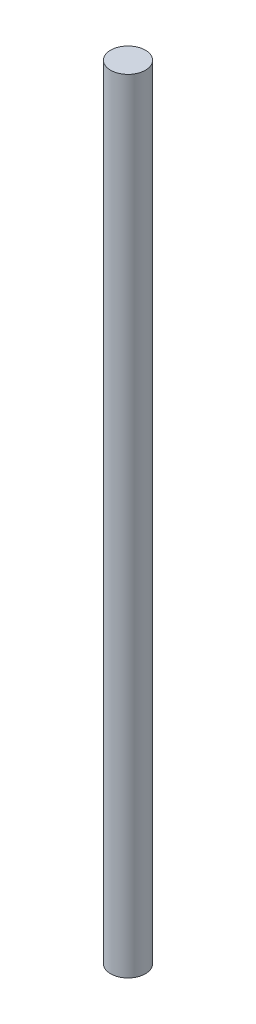
ISO-10303-21;
HEADER;
FILE_DESCRIPTION(('STEP AP214'),'2;1');
FILE_NAME('part.step','',(''),(''),'','','');
FILE_SCHEMA(('AUTOMOTIVE_DESIGN { 1 0 10303 214 1 1 1 1 }'));
ENDSEC;
DATA;
#1=APPLICATION_CONTEXT('core data for automotive mechanical design processes');
#2=APPLICATION_PROTOCOL_DEFINITION('international standard','automotive_design',2000,#1);
#3=PRODUCT_CONTEXT('',#1,'mechanical');
#4=PRODUCT('Part','Part','',(#3));
#5=PRODUCT_RELATED_PRODUCT_CATEGORY('part','',(#4));
#6=PRODUCT_DEFINITION_FORMATION('','',#4);
#7=PRODUCT_DEFINITION_CONTEXT('part definition',#1,'design');
#8=PRODUCT_DEFINITION('design','',#6,#7);
#9=PRODUCT_DEFINITION_SHAPE('','',#8);
#10=(LENGTH_UNIT() NAMED_UNIT(*) SI_UNIT(.MILLI.,.METRE.));
#11=(NAMED_UNIT(*) PLANE_ANGLE_UNIT() SI_UNIT($,.RADIAN.));
#12=(NAMED_UNIT(*) SI_UNIT($,.STERADIAN.) SOLID_ANGLE_UNIT());
#13=UNCERTAINTY_MEASURE_WITH_UNIT(LENGTH_MEASURE(1.E-05),#10,'distance_accuracy_value','');
#14=(GEOMETRIC_REPRESENTATION_CONTEXT(3) GLOBAL_UNCERTAINTY_ASSIGNED_CONTEXT((#13)) GLOBAL_UNIT_ASSIGNED_CONTEXT((#10,
#11,#12)) REPRESENTATION_CONTEXT('',''));
#15=CARTESIAN_POINT('',(0.,0.,0.));
#16=DIRECTION('',(0.,0.,1.));
#17=DIRECTION('',(1.,0.,0.));
#18=AXIS2_PLACEMENT_3D('',#15,#16,#17);
#19=CARTESIAN_POINT('',(0.,45.,0.));
#20=DIRECTION('',(0.,-1.,0.));
#21=DIRECTION('',(0.,0.,-1.));
#22=AXIS2_PLACEMENT_3D('',#19,#20,#21);
#23=CYLINDRICAL_SURFACE('',#22,1.);
#24=CARTESIAN_POINT('',(0.,45.,0.));
#25=DIRECTION('',(0.,1.,0.));
#26=DIRECTION('',(0.,0.,1.));
#27=AXIS2_PLACEMENT_3D('',#24,#25,#26);
#28=CIRCLE('',#27,1.);
#29=CARTESIAN_POINT('',(0.,45.,-1.));
#30=VERTEX_POINT('',#29);
#31=EDGE_CURVE('E10',#30,#30,#28,.T.);
#32=CARTESIAN_POINT('',(0.,0.,0.));
#33=DIRECTION('',(0.,1.,0.));
#34=DIRECTION('',(0.,0.,1.));
#35=AXIS2_PLACEMENT_3D('',#32,#33,#34);
#36=CIRCLE('',#35,1.);
#37=CARTESIAN_POINT('',(0.,0.,-1.));
#38=VERTEX_POINT('',#37);
#39=EDGE_CURVE('E38',#38,#38,#36,.T.);
#40=CARTESIAN_POINT('',(0.,45.,-1.));
#41=CARTESIAN_POINT('',(0.,44.53125,-1.));
#42=CARTESIAN_POINT('',(0.,44.0625,-1.));
#43=CARTESIAN_POINT('',(0.,43.125,-1.));
#44=CARTESIAN_POINT('',(0.,42.65625,-1.));
#45=CARTESIAN_POINT('',(0.,41.71875,-1.));
#46=CARTESIAN_POINT('',(0.,41.25,-1.));
#47=CARTESIAN_POINT('',(0.,40.3125,-1.));
#48=CARTESIAN_POINT('',(0.,39.84375,-1.));
#49=CARTESIAN_POINT('',(0.,38.90625,-1.));
#50=CARTESIAN_POINT('',(0.,38.4375,-1.));
#51=CARTESIAN_POINT('',(0.,37.5,-1.));
#52=CARTESIAN_POINT('',(0.,37.03125,-1.));
#53=CARTESIAN_POINT('',(0.,36.09375,-1.));
#54=CARTESIAN_POINT('',(0.,35.625,-1.));
#55=CARTESIAN_POINT('',(0.,34.6875,-1.));
#56=CARTESIAN_POINT('',(0.,34.21875,-1.));
#57=CARTESIAN_POINT('',(0.,33.28125,-1.));
#58=CARTESIAN_POINT('',(0.,32.8125,-1.));
#59=CARTESIAN_POINT('',(0.,31.875,-1.));
#60=CARTESIAN_POINT('',(0.,31.40625,-1.));
#61=CARTESIAN_POINT('',(0.,30.46875,-1.));
#62=CARTESIAN_POINT('',(0.,30.,-1.));
#63=CARTESIAN_POINT('',(0.,29.0625,-1.));
#64=CARTESIAN_POINT('',(0.,28.59375,-1.));
#65=CARTESIAN_POINT('',(0.,27.65625,-1.));
#66=CARTESIAN_POINT('',(0.,27.1875,-1.));
#67=CARTESIAN_POINT('',(0.,26.25,-1.));
#68=CARTESIAN_POINT('',(0.,25.78125,-1.));
#69=CARTESIAN_POINT('',(0.,24.84375,-1.));
#70=CARTESIAN_POINT('',(0.,24.375,-1.));
#71=CARTESIAN_POINT('',(0.,23.4375,-1.));
#72=CARTESIAN_POINT('',(0.,22.96875,-1.));
#73=CARTESIAN_POINT('',(0.,22.03125,-1.));
#74=CARTESIAN_POINT('',(0.,21.5625,-1.));
#75=CARTESIAN_POINT('',(0.,20.625,-1.));
#76=CARTESIAN_POINT('',(0.,20.15625,-1.));
#77=CARTESIAN_POINT('',(0.,19.21875,-1.));
#78=CARTESIAN_POINT('',(0.,18.75,-1.));
#79=CARTESIAN_POINT('',(0.,17.8125,-1.));
#80=CARTESIAN_POINT('',(0.,17.34375,-1.));
#81=CARTESIAN_POINT('',(0.,16.40625,-1.));
#82=CARTESIAN_POINT('',(0.,15.9375,-1.));
#83=CARTESIAN_POINT('',(0.,15.,-1.));
#84=CARTESIAN_POINT('',(0.,14.53125,-1.));
#85=CARTESIAN_POINT('',(0.,13.59375,-1.));
#86=CARTESIAN_POINT('',(0.,13.125,-1.));
#87=CARTESIAN_POINT('',(0.,12.1875,-1.));
#88=CARTESIAN_POINT('',(0.,11.71875,-1.));
#89=CARTESIAN_POINT('',(0.,10.78125,-1.));
#90=CARTESIAN_POINT('',(0.,10.3125,-1.));
#91=CARTESIAN_POINT('',(0.,9.37499999999999,-1.));
#92=CARTESIAN_POINT('',(0.,8.90624999999999,-1.));
#93=CARTESIAN_POINT('',(0.,7.96874999999999,-1.));
#94=CARTESIAN_POINT('',(0.,7.5,-1.));
#95=CARTESIAN_POINT('',(0.,6.56249999999999,-1.));
#96=CARTESIAN_POINT('',(0.,6.09374999999999,-1.));
#97=CARTESIAN_POINT('',(0.,5.15624999999999,-1.));
#98=CARTESIAN_POINT('',(0.,4.68749999999999,-1.));
#99=CARTESIAN_POINT('',(0.,3.74999999999999,-1.));
#100=CARTESIAN_POINT('',(0.,3.28124999999999,-1.));
#101=CARTESIAN_POINT('',(0.,2.34374999999999,-1.));
#102=CARTESIAN_POINT('',(0.,1.87499999999999,-1.));
#103=CARTESIAN_POINT('',(0.,0.937499999999992,-1.));
#104=CARTESIAN_POINT('',(0.,0.468749999999993,-1.));
#105=CARTESIAN_POINT('',(0.,0.,-1.));
#106=B_SPLINE_CURVE_WITH_KNOTS('',3,(#40,#41,#42,#43,#44,#45,#46,#47,#48,#49,#50,#51,#52,#53,
#54,#55,#56,#57,#58,#59,#60,#61,#62,#63,#64,#65,#66,#67,#68,#69,#70,#71,#72,#73,#74,#75,#76,#77,
#78,#79,#80,#81,#82,#83,#84,#85,#86,#87,#88,#89,#90,#91,#92,#93,#94,#95,#96,#97,#98,#99,#100,
#101,#102,#103,#104,#105),.UNSPECIFIED.,.F.,.F.,(4,2,2,2,2,2,2,2,2,2,2,2,2,2,2,2,2,2,2,2,2,2,2,
2,2,2,2,2,2,2,2,2,4),(0.,1.40625,2.8125,4.21874999999999,5.625,7.03125,8.43749999999999,9.84375,
11.25,12.65625,14.0625,15.46875,16.875,18.28125,19.6875,21.09375,22.5,23.90625,25.3125,26.71875,
28.125,29.53125,30.9375,32.34375,33.75,35.15625,36.5625,37.96875,39.375,40.78125,42.1875,
43.59375,45.),.UNSPECIFIED.);
#107=EDGE_CURVE('BSEAM35',#30,#38,#106,.T.);
#108=ORIENTED_EDGE('',*,*,#31,.F.);
#109=ORIENTED_EDGE('',*,*,#39,.T.);
#110=ORIENTED_EDGE('',*,*,#107,.T.);
#111=ORIENTED_EDGE('',*,*,#107,.F.);
#112=EDGE_LOOP('',(#108,#110,#109,#111));
#113=FACE_BOUND('',#112,.T.);
#114=ADVANCED_FACE('F35',(#113),#23,.T.);
#115=CARTESIAN_POINT('',(0.,45.,0.));
#116=DIRECTION('',(0.,1.,0.));
#117=DIRECTION('',(0.,0.,1.));
#118=AXIS2_PLACEMENT_3D('',#115,#116,#117);
#119=PLANE('',#118);
#120=ORIENTED_EDGE('',*,*,#31,.T.);
#121=EDGE_LOOP('',(#120));
#122=FACE_BOUND('',#121,.T.);
#123=ADVANCED_FACE('F50',(#122),#119,.T.);
#124=CARTESIAN_POINT('',(0.,0.,0.));
#125=DIRECTION('',(0.,1.,0.));
#126=DIRECTION('',(0.,0.,1.));
#127=AXIS2_PLACEMENT_3D('',#124,#125,#126);
#128=PLANE('',#127);
#129=ORIENTED_EDGE('',*,*,#39,.F.);
#130=EDGE_LOOP('',(#129));
#131=FACE_BOUND('',#130,.T.);
#132=ADVANCED_FACE('F48',(#131),#128,.F.);
#133=CLOSED_SHELL('',(#114,#123,#132));
#134=MANIFOLD_SOLID_BREP('B2',#133);
#135=ADVANCED_BREP_SHAPE_REPRESENTATION('',(#18,#134),#14);
#136=SHAPE_DEFINITION_REPRESENTATION(#9,#135);
ENDSEC;
END-ISO-10303-21;
